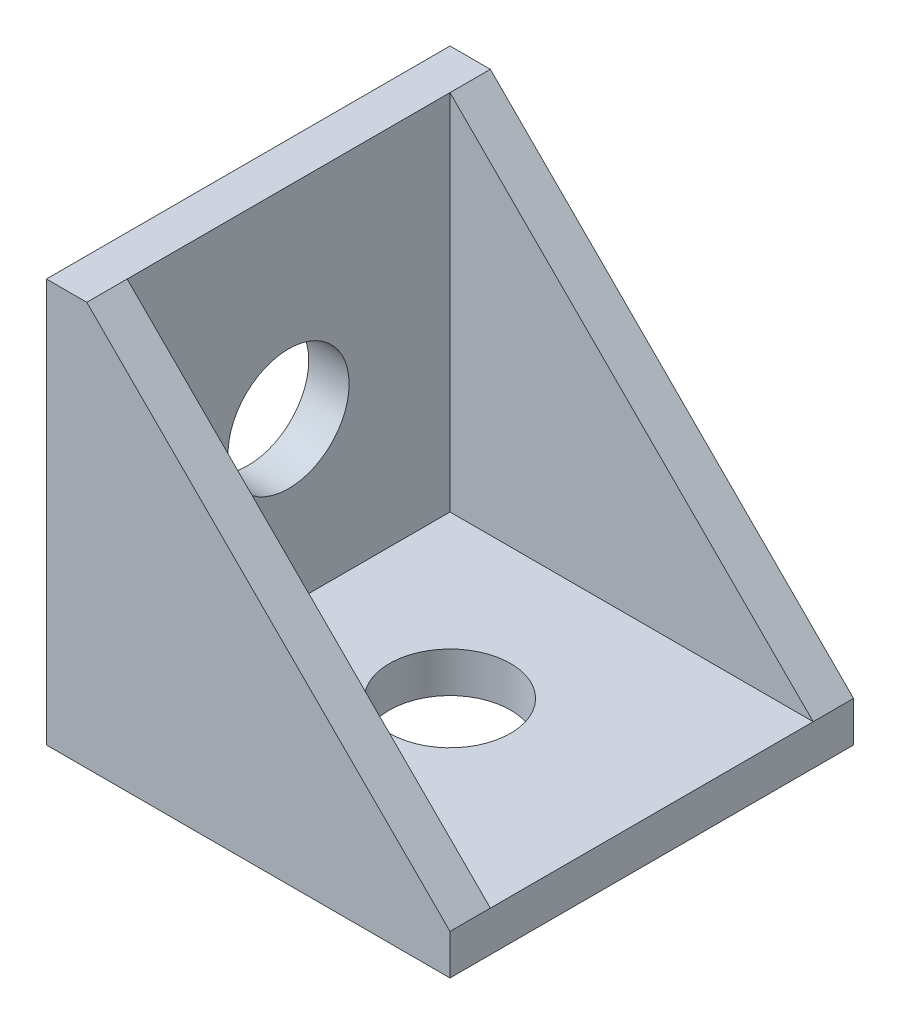
ISO-10303-21;
HEADER;
FILE_DESCRIPTION(('STEP AP214'),'2;1');
FILE_NAME('part.step','',(''),(''),'','','');
FILE_SCHEMA(('AUTOMOTIVE_DESIGN { 1 0 10303 214 1 1 1 1 }'));
ENDSEC;
DATA;
#1=APPLICATION_CONTEXT('core data for automotive mechanical design processes');
#2=APPLICATION_PROTOCOL_DEFINITION('international standard','automotive_design',2000,#1);
#3=PRODUCT_CONTEXT('',#1,'mechanical');
#4=PRODUCT('Part','Part','',(#3));
#5=PRODUCT_RELATED_PRODUCT_CATEGORY('part','',(#4));
#6=PRODUCT_DEFINITION_FORMATION('','',#4);
#7=PRODUCT_DEFINITION_CONTEXT('part definition',#1,'design');
#8=PRODUCT_DEFINITION('design','',#6,#7);
#9=PRODUCT_DEFINITION_SHAPE('','',#8);
#10=(LENGTH_UNIT() NAMED_UNIT(*) SI_UNIT(.MILLI.,.METRE.));
#11=(NAMED_UNIT(*) PLANE_ANGLE_UNIT() SI_UNIT($,.RADIAN.));
#12=(NAMED_UNIT(*) SI_UNIT($,.STERADIAN.) SOLID_ANGLE_UNIT());
#13=UNCERTAINTY_MEASURE_WITH_UNIT(LENGTH_MEASURE(1.E-05),#10,'distance_accuracy_value','');
#14=(GEOMETRIC_REPRESENTATION_CONTEXT(3) GLOBAL_UNCERTAINTY_ASSIGNED_CONTEXT((#13)) GLOBAL_UNIT_ASSIGNED_CONTEXT((#10,
#11,#12)) REPRESENTATION_CONTEXT('',''));
#15=CARTESIAN_POINT('',(0.,0.,0.));
#16=DIRECTION('',(0.,0.,1.));
#17=DIRECTION('',(1.,0.,0.));
#18=AXIS2_PLACEMENT_3D('',#15,#16,#17);
#19=CARTESIAN_POINT('',(2.,20.,10.));
#20=DIRECTION('',(-0.707106781186548,-0.707106781186548,0.));
#21=DIRECTION('',(0.707106781186548,-0.707106781186548,0.));
#22=AXIS2_PLACEMENT_3D('',#19,#20,#21);
#23=PLANE('',#22);
#24=DIRECTION('',(0.,0.,-1.));
#25=VECTOR('',#24,1.);
#26=CARTESIAN_POINT('',(2.,20.,10.));
#27=LINE('',#26,#25);
#28=CARTESIAN_POINT('',(2.,20.,-8.));
#29=VERTEX_POINT('',#28);
#30=CARTESIAN_POINT('',(2.,20.,-10.));
#31=VERTEX_POINT('',#30);
#32=EDGE_CURVE('E113',#29,#31,#27,.T.);
#33=ORIENTED_EDGE('',*,*,#32,.F.);
#34=DIRECTION('',(0.707106781186548,-0.707106781186548,0.));
#35=VECTOR('',#34,1.);
#36=CARTESIAN_POINT('',(2.,20.,-8.));
#37=LINE('',#36,#35);
#38=CARTESIAN_POINT('',(20.,2.,-8.));
#39=VERTEX_POINT('',#38);
#40=EDGE_CURVE('E11',#29,#39,#37,.T.);
#41=ORIENTED_EDGE('',*,*,#40,.T.);
#42=DIRECTION('',(0.,0.,-1.));
#43=VECTOR('',#42,1.);
#44=CARTESIAN_POINT('',(20.,2.,10.));
#45=LINE('',#44,#43);
#46=CARTESIAN_POINT('',(20.,2.,-10.));
#47=VERTEX_POINT('',#46);
#48=EDGE_CURVE('E137',#39,#47,#45,.T.);
#49=ORIENTED_EDGE('',*,*,#48,.T.);
#50=DIRECTION('',(-0.707106781186547,0.707106781186547,0.));
#51=VECTOR('',#50,1.);
#52=CARTESIAN_POINT('',(2.,20.,-10.));
#53=LINE('',#52,#51);
#54=EDGE_CURVE('E125',#47,#31,#53,.T.);
#55=ORIENTED_EDGE('',*,*,#54,.T.);
#56=EDGE_LOOP('',(#33,#41,#49,#55));
#57=FACE_BOUND('',#56,.T.);
#58=ADVANCED_FACE('F33',(#57),#23,.F.);
#59=CARTESIAN_POINT('',(20.,2.,10.));
#60=DIRECTION('',(-1.,0.,0.));
#61=DIRECTION('',(0.,0.,1.));
#62=AXIS2_PLACEMENT_3D('',#59,#60,#61);
#63=PLANE('',#62);
#64=DIRECTION('',(0.,1.,0.));
#65=VECTOR('',#64,1.);
#66=CARTESIAN_POINT('',(20.,2.,-10.));
#67=LINE('',#66,#65);
#68=CARTESIAN_POINT('',(20.,0.,-10.));
#69=VERTEX_POINT('',#68);
#70=EDGE_CURVE('E122',#69,#47,#67,.T.);
#71=ORIENTED_EDGE('',*,*,#70,.T.);
#72=ORIENTED_EDGE('',*,*,#48,.F.);
#73=DIRECTION('',(0.,0.,-1.));
#74=VECTOR('',#73,1.);
#75=CARTESIAN_POINT('',(20.,2.,8.));
#76=LINE('',#75,#74);
#77=CARTESIAN_POINT('',(20.,2.,8.));
#78=VERTEX_POINT('',#77);
#79=EDGE_CURVE('E174',#78,#39,#76,.T.);
#80=ORIENTED_EDGE('',*,*,#79,.F.);
#81=CARTESIAN_POINT('',(20.,2.,10.));
#82=VERTEX_POINT('',#81);
#83=EDGE_CURVE('E138',#82,#78,#45,.T.);
#84=ORIENTED_EDGE('',*,*,#83,.F.);
#85=DIRECTION('',(0.,1.,0.));
#86=VECTOR('',#85,1.);
#87=CARTESIAN_POINT('',(20.,2.,10.));
#88=LINE('',#87,#86);
#89=CARTESIAN_POINT('',(20.,0.,10.));
#90=VERTEX_POINT('',#89);
#91=EDGE_CURVE('E132',#90,#82,#88,.T.);
#92=ORIENTED_EDGE('',*,*,#91,.F.);
#93=DIRECTION('',(0.,0.,-1.));
#94=VECTOR('',#93,1.);
#95=CARTESIAN_POINT('',(20.,0.,10.));
#96=LINE('',#95,#94);
#97=EDGE_CURVE('E118',#90,#69,#96,.T.);
#98=ORIENTED_EDGE('',*,*,#97,.T.);
#99=EDGE_LOOP('',(#71,#72,#80,#84,#92,#98));
#100=FACE_BOUND('',#99,.T.);
#101=ADVANCED_FACE('F35',(#100),#63,.F.);
#102=ORIENTED_EDGE('',*,*,#83,.T.);
#103=DIRECTION('',(-0.707106781186548,0.707106781186548,0.));
#104=VECTOR('',#103,1.);
#105=CARTESIAN_POINT('',(2.,20.,8.));
#106=LINE('',#105,#104);
#107=CARTESIAN_POINT('',(2.,20.,8.));
#108=VERTEX_POINT('',#107);
#109=EDGE_CURVE('E41',#78,#108,#106,.T.);
#110=ORIENTED_EDGE('',*,*,#109,.T.);
#111=CARTESIAN_POINT('',(2.,20.,10.));
#112=VERTEX_POINT('',#111);
#113=EDGE_CURVE('E135',#112,#108,#27,.T.);
#114=ORIENTED_EDGE('',*,*,#113,.F.);
#115=DIRECTION('',(-0.707106781186547,0.707106781186547,0.));
#116=VECTOR('',#115,1.);
#117=CARTESIAN_POINT('',(2.,20.,10.));
#118=LINE('',#117,#116);
#119=EDGE_CURVE('E90',#82,#112,#118,.T.);
#120=ORIENTED_EDGE('',*,*,#119,.F.);
#121=EDGE_LOOP('',(#102,#110,#114,#120));
#122=FACE_BOUND('',#121,.T.);
#123=ADVANCED_FACE('F141',(#122),#23,.F.);
#124=CARTESIAN_POINT('',(0.,20.,10.));
#125=DIRECTION('',(0.,-1.,0.));
#126=DIRECTION('',(0.,0.,-1.));
#127=AXIS2_PLACEMENT_3D('',#124,#125,#126);
#128=PLANE('',#127);
#129=DIRECTION('',(-1.,0.,0.));
#130=VECTOR('',#129,1.);
#131=CARTESIAN_POINT('',(0.,20.,-10.));
#132=LINE('',#131,#130);
#133=CARTESIAN_POINT('',(0.,20.,-10.));
#134=VERTEX_POINT('',#133);
#135=EDGE_CURVE('E110',#31,#134,#132,.T.);
#136=ORIENTED_EDGE('',*,*,#135,.T.);
#137=DIRECTION('',(0.,0.,-1.));
#138=VECTOR('',#137,1.);
#139=CARTESIAN_POINT('',(0.,20.,10.));
#140=LINE('',#139,#138);
#141=CARTESIAN_POINT('',(0.,20.,10.));
#142=VERTEX_POINT('',#141);
#143=EDGE_CURVE('E107',#142,#134,#140,.T.);
#144=ORIENTED_EDGE('',*,*,#143,.F.);
#145=DIRECTION('',(-1.,0.,0.));
#146=VECTOR('',#145,1.);
#147=CARTESIAN_POINT('',(0.,20.,10.));
#148=LINE('',#147,#146);
#149=EDGE_CURVE('E97',#112,#142,#148,.T.);
#150=ORIENTED_EDGE('',*,*,#149,.F.);
#151=ORIENTED_EDGE('',*,*,#113,.T.);
#152=DIRECTION('',(0.,0.,1.));
#153=VECTOR('',#152,1.);
#154=CARTESIAN_POINT('',(2.,20.,8.));
#155=LINE('',#154,#153);
#156=EDGE_CURVE('E150',#29,#108,#155,.T.);
#157=ORIENTED_EDGE('',*,*,#156,.F.);
#158=ORIENTED_EDGE('',*,*,#32,.T.);
#159=EDGE_LOOP('',(#136,#144,#150,#151,#157,#158));
#160=FACE_BOUND('',#159,.T.);
#161=ADVANCED_FACE('F108',(#160),#128,.F.);
#162=CARTESIAN_POINT('',(0.,0.,10.));
#163=DIRECTION('',(1.,0.,0.));
#164=DIRECTION('',(0.,0.,-1.));
#165=AXIS2_PLACEMENT_3D('',#162,#163,#164);
#166=PLANE('',#165);
#167=CARTESIAN_POINT('',(0.,10.,0.));
#168=DIRECTION('',(1.,0.,0.));
#169=DIRECTION('',(0.,0.,-1.));
#170=AXIS2_PLACEMENT_3D('',#167,#168,#169);
#171=CIRCLE('',#170,3.);
#172=CARTESIAN_POINT('',(0.,10.,-3.));
#173=VERTEX_POINT('',#172);
#174=EDGE_CURVE('E154',#173,#173,#171,.T.);
#175=ORIENTED_EDGE('',*,*,#174,.T.);
#176=EDGE_LOOP('',(#175));
#177=FACE_BOUND('',#176,.T.);
#178=DIRECTION('',(0.,-1.,0.));
#179=VECTOR('',#178,1.);
#180=CARTESIAN_POINT('',(0.,0.,-10.));
#181=LINE('',#180,#179);
#182=CARTESIAN_POINT('',(0.,0.,-10.));
#183=VERTEX_POINT('',#182);
#184=EDGE_CURVE('E129',#134,#183,#181,.T.);
#185=ORIENTED_EDGE('',*,*,#184,.T.);
#186=DIRECTION('',(0.,0.,-1.));
#187=VECTOR('',#186,1.);
#188=CARTESIAN_POINT('',(0.,0.,10.));
#189=LINE('',#188,#187);
#190=CARTESIAN_POINT('',(0.,0.,10.));
#191=VERTEX_POINT('',#190);
#192=EDGE_CURVE('E114',#191,#183,#189,.T.);
#193=ORIENTED_EDGE('',*,*,#192,.F.);
#194=DIRECTION('',(0.,-1.,0.));
#195=VECTOR('',#194,1.);
#196=CARTESIAN_POINT('',(0.,0.,10.));
#197=LINE('',#196,#195);
#198=EDGE_CURVE('E101',#142,#191,#197,.T.);
#199=ORIENTED_EDGE('',*,*,#198,.F.);
#200=ORIENTED_EDGE('',*,*,#143,.T.);
#201=EDGE_LOOP('',(#185,#193,#199,#200));
#202=FACE_BOUND('',#201,.T.);
#203=ADVANCED_FACE('F116',(#177,#202),#166,.F.);
#204=CARTESIAN_POINT('',(20.,0.,10.));
#205=DIRECTION('',(0.,1.,0.));
#206=DIRECTION('',(-1.,0.,0.));
#207=AXIS2_PLACEMENT_3D('',#204,#205,#206);
#208=PLANE('',#207);
#209=CARTESIAN_POINT('',(10.,0.,0.));
#210=DIRECTION('',(0.,1.,0.));
#211=DIRECTION('',(-1.,0.,0.));
#212=AXIS2_PLACEMENT_3D('',#209,#210,#211);
#213=CIRCLE('',#212,3.);
#214=CARTESIAN_POINT('',(7.,0.,0.));
#215=VERTEX_POINT('',#214);
#216=EDGE_CURVE('E184',#215,#215,#213,.T.);
#217=ORIENTED_EDGE('',*,*,#216,.T.);
#218=EDGE_LOOP('',(#217));
#219=FACE_BOUND('',#218,.T.);
#220=DIRECTION('',(1.,0.,0.));
#221=VECTOR('',#220,1.);
#222=CARTESIAN_POINT('',(20.,0.,-10.));
#223=LINE('',#222,#221);
#224=EDGE_CURVE('E81',#183,#69,#223,.T.);
#225=ORIENTED_EDGE('',*,*,#224,.T.);
#226=ORIENTED_EDGE('',*,*,#97,.F.);
#227=DIRECTION('',(1.,0.,0.));
#228=VECTOR('',#227,1.);
#229=CARTESIAN_POINT('',(20.,0.,10.));
#230=LINE('',#229,#228);
#231=EDGE_CURVE('E57',#191,#90,#230,.T.);
#232=ORIENTED_EDGE('',*,*,#231,.F.);
#233=ORIENTED_EDGE('',*,*,#192,.T.);
#234=EDGE_LOOP('',(#225,#226,#232,#233));
#235=FACE_BOUND('',#234,.T.);
#236=ADVANCED_FACE('F208',(#219,#235),#208,.F.);
#237=CARTESIAN_POINT('',(0.,0.,10.));
#238=DIRECTION('',(0.,0.,-1.));
#239=DIRECTION('',(-1.,0.,0.));
#240=AXIS2_PLACEMENT_3D('',#237,#238,#239);
#241=PLANE('',#240);
#242=ORIENTED_EDGE('',*,*,#91,.T.);
#243=ORIENTED_EDGE('',*,*,#119,.T.);
#244=ORIENTED_EDGE('',*,*,#149,.T.);
#245=ORIENTED_EDGE('',*,*,#198,.T.);
#246=ORIENTED_EDGE('',*,*,#231,.T.);
#247=EDGE_LOOP('',(#242,#243,#244,#245,#246));
#248=FACE_BOUND('',#247,.T.);
#249=ADVANCED_FACE('F99',(#248),#241,.F.);
#250=CARTESIAN_POINT('',(0.,0.,-10.));
#251=DIRECTION('',(0.,0.,-1.));
#252=DIRECTION('',(-1.,0.,0.));
#253=AXIS2_PLACEMENT_3D('',#250,#251,#252);
#254=PLANE('',#253);
#255=ORIENTED_EDGE('',*,*,#70,.F.);
#256=ORIENTED_EDGE('',*,*,#224,.F.);
#257=ORIENTED_EDGE('',*,*,#184,.F.);
#258=ORIENTED_EDGE('',*,*,#135,.F.);
#259=ORIENTED_EDGE('',*,*,#54,.F.);
#260=EDGE_LOOP('',(#255,#256,#257,#258,#259));
#261=FACE_BOUND('',#260,.T.);
#262=ADVANCED_FACE('F207',(#261),#254,.T.);
#263=CARTESIAN_POINT('',(20.,2.,-8.));
#264=DIRECTION('',(0.,0.,-1.));
#265=DIRECTION('',(-1.,0.,0.));
#266=AXIS2_PLACEMENT_3D('',#263,#264,#265);
#267=PLANE('',#266);
#268=DIRECTION('',(0.,1.,0.));
#269=VECTOR('',#268,1.);
#270=CARTESIAN_POINT('',(2.,2.,-8.));
#271=LINE('',#270,#269);
#272=CARTESIAN_POINT('',(2.,2.,-8.));
#273=VERTEX_POINT('',#272);
#274=EDGE_CURVE('E48',#273,#29,#271,.T.);
#275=ORIENTED_EDGE('',*,*,#274,.F.);
#276=DIRECTION('',(-1.,0.,0.));
#277=VECTOR('',#276,1.);
#278=CARTESIAN_POINT('',(20.,2.,-8.));
#279=LINE('',#278,#277);
#280=EDGE_CURVE('E164',#39,#273,#279,.T.);
#281=ORIENTED_EDGE('',*,*,#280,.F.);
#282=ORIENTED_EDGE('',*,*,#40,.F.);
#283=EDGE_LOOP('',(#275,#281,#282));
#284=FACE_BOUND('',#283,.T.);
#285=ADVANCED_FACE('F202',(#284),#267,.F.);
#286=CARTESIAN_POINT('',(20.,2.,8.));
#287=DIRECTION('',(0.,0.,1.));
#288=DIRECTION('',(1.,0.,0.));
#289=AXIS2_PLACEMENT_3D('',#286,#287,#288);
#290=PLANE('',#289);
#291=DIRECTION('',(1.,0.,0.));
#292=VECTOR('',#291,1.);
#293=CARTESIAN_POINT('',(20.,2.,8.));
#294=LINE('',#293,#292);
#295=CARTESIAN_POINT('',(2.,2.,8.));
#296=VERTEX_POINT('',#295);
#297=EDGE_CURVE('E157',#296,#78,#294,.T.);
#298=ORIENTED_EDGE('',*,*,#297,.F.);
#299=DIRECTION('',(0.,1.,0.));
#300=VECTOR('',#299,1.);
#301=CARTESIAN_POINT('',(2.,2.,8.));
#302=LINE('',#301,#300);
#303=EDGE_CURVE('E167',#296,#108,#302,.T.);
#304=ORIENTED_EDGE('',*,*,#303,.T.);
#305=ORIENTED_EDGE('',*,*,#109,.F.);
#306=EDGE_LOOP('',(#298,#304,#305));
#307=FACE_BOUND('',#306,.T.);
#308=ADVANCED_FACE('F243',(#307),#290,.F.);
#309=CARTESIAN_POINT('',(2.,2.,8.));
#310=DIRECTION('',(-1.,0.,0.));
#311=DIRECTION('',(0.,0.,1.));
#312=AXIS2_PLACEMENT_3D('',#309,#310,#311);
#313=PLANE('',#312);
#314=CARTESIAN_POINT('',(2.,10.,0.));
#315=DIRECTION('',(1.,0.,0.));
#316=DIRECTION('',(0.,0.,-1.));
#317=AXIS2_PLACEMENT_3D('',#314,#315,#316);
#318=CIRCLE('',#317,3.);
#319=CARTESIAN_POINT('',(2.,10.,-3.));
#320=VERTEX_POINT('',#319);
#321=EDGE_CURVE('E160',#320,#320,#318,.T.);
#322=ORIENTED_EDGE('',*,*,#321,.F.);
#323=EDGE_LOOP('',(#322));
#324=FACE_BOUND('',#323,.T.);
#325=ORIENTED_EDGE('',*,*,#156,.T.);
#326=ORIENTED_EDGE('',*,*,#303,.F.);
#327=DIRECTION('',(0.,0.,1.));
#328=VECTOR('',#327,1.);
#329=CARTESIAN_POINT('',(2.,2.,8.));
#330=LINE('',#329,#328);
#331=EDGE_CURVE('E153',#273,#296,#330,.T.);
#332=ORIENTED_EDGE('',*,*,#331,.F.);
#333=ORIENTED_EDGE('',*,*,#274,.T.);
#334=EDGE_LOOP('',(#325,#326,#332,#333));
#335=FACE_BOUND('',#334,.T.);
#336=ADVANCED_FACE('F197',(#324,#335),#313,.F.);
#337=CARTESIAN_POINT('',(0.,2.,0.));
#338=DIRECTION('',(0.,1.,0.));
#339=DIRECTION('',(0.,0.,1.));
#340=AXIS2_PLACEMENT_3D('',#337,#338,#339);
#341=PLANE('',#340);
#342=CARTESIAN_POINT('',(10.,2.,0.));
#343=DIRECTION('',(0.,1.,0.));
#344=DIRECTION('',(0.,0.,1.));
#345=AXIS2_PLACEMENT_3D('',#342,#343,#344);
#346=CIRCLE('',#345,3.);
#347=CARTESIAN_POINT('',(10.,2.,3.));
#348=VERTEX_POINT('',#347);
#349=EDGE_CURVE('E187',#348,#348,#346,.T.);
#350=ORIENTED_EDGE('',*,*,#349,.F.);
#351=EDGE_LOOP('',(#350));
#352=FACE_BOUND('',#351,.T.);
#353=ORIENTED_EDGE('',*,*,#331,.T.);
#354=ORIENTED_EDGE('',*,*,#297,.T.);
#355=ORIENTED_EDGE('',*,*,#79,.T.);
#356=ORIENTED_EDGE('',*,*,#280,.T.);
#357=EDGE_LOOP('',(#353,#354,#355,#356));
#358=FACE_BOUND('',#357,.T.);
#359=ADVANCED_FACE('F194',(#352,#358),#341,.T.);
#360=CARTESIAN_POINT('',(-18.,10.,0.));
#361=DIRECTION('',(1.,0.,0.));
#362=DIRECTION('',(0.,0.,-1.));
#363=AXIS2_PLACEMENT_3D('',#360,#361,#362);
#364=CYLINDRICAL_SURFACE('',#363,3.);
#365=ORIENTED_EDGE('',*,*,#321,.T.);
#366=EDGE_LOOP('',(#365));
#367=FACE_BOUND('',#366,.T.);
#368=ORIENTED_EDGE('',*,*,#174,.F.);
#369=EDGE_LOOP('',(#368));
#370=FACE_BOUND('',#369,.T.);
#371=ADVANCED_FACE('F196',(#367,#370),#364,.F.);
#372=CARTESIAN_POINT('',(10.,-18.,0.));
#373=DIRECTION('',(0.,1.,0.));
#374=DIRECTION('',(0.,0.,1.));
#375=AXIS2_PLACEMENT_3D('',#372,#373,#374);
#376=CYLINDRICAL_SURFACE('',#375,3.);
#377=ORIENTED_EDGE('',*,*,#349,.T.);
#378=EDGE_LOOP('',(#377));
#379=FACE_BOUND('',#378,.T.);
#380=ORIENTED_EDGE('',*,*,#216,.F.);
#381=EDGE_LOOP('',(#380));
#382=FACE_BOUND('',#381,.T.);
#383=ADVANCED_FACE('F191',(#379,#382),#376,.F.);
#384=CLOSED_SHELL('',(#58,#101,#123,#161,#203,#236,#249,#262,#285,#308,#336,#359,#371,#383));
#385=MANIFOLD_SOLID_BREP('B2',#384);
#386=ADVANCED_BREP_SHAPE_REPRESENTATION('',(#18,#385),#14);
#387=SHAPE_DEFINITION_REPRESENTATION(#9,#386);
ENDSEC;
END-ISO-10303-21;
